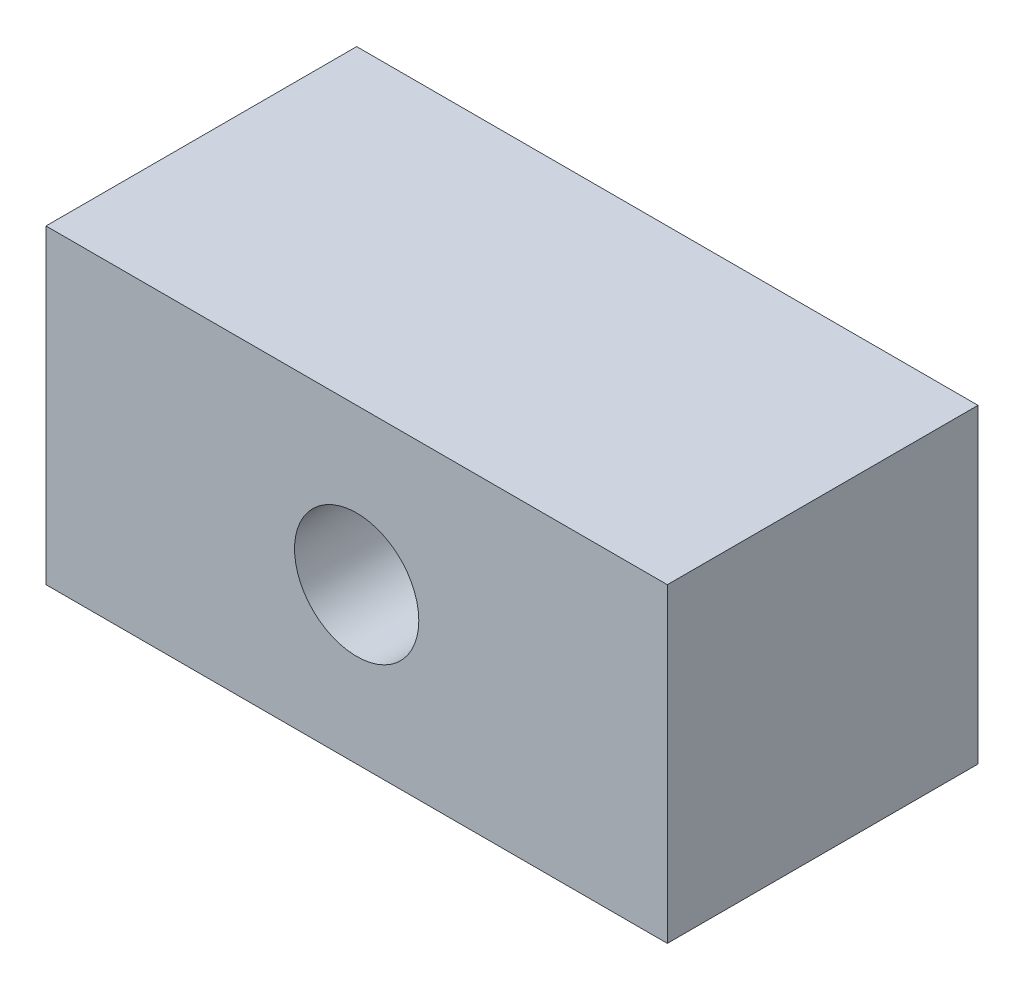
ISO-10303-21;
HEADER;
FILE_DESCRIPTION(('STEP AP214'),'2;1');
FILE_NAME('part.step','',(''),(''),'','','');
FILE_SCHEMA(('AUTOMOTIVE_DESIGN { 1 0 10303 214 1 1 1 1 }'));
ENDSEC;
DATA;
#1=APPLICATION_CONTEXT('core data for automotive mechanical design processes');
#2=APPLICATION_PROTOCOL_DEFINITION('international standard','automotive_design',2000,#1);
#3=PRODUCT_CONTEXT('',#1,'mechanical');
#4=PRODUCT('Part','Part','',(#3));
#5=PRODUCT_RELATED_PRODUCT_CATEGORY('part','',(#4));
#6=PRODUCT_DEFINITION_FORMATION('','',#4);
#7=PRODUCT_DEFINITION_CONTEXT('part definition',#1,'design');
#8=PRODUCT_DEFINITION('design','',#6,#7);
#9=PRODUCT_DEFINITION_SHAPE('','',#8);
#10=(LENGTH_UNIT() NAMED_UNIT(*) SI_UNIT(.MILLI.,.METRE.));
#11=(NAMED_UNIT(*) PLANE_ANGLE_UNIT() SI_UNIT($,.RADIAN.));
#12=(NAMED_UNIT(*) SI_UNIT($,.STERADIAN.) SOLID_ANGLE_UNIT());
#13=UNCERTAINTY_MEASURE_WITH_UNIT(LENGTH_MEASURE(1.E-05),#10,'distance_accuracy_value','');
#14=(GEOMETRIC_REPRESENTATION_CONTEXT(3) GLOBAL_UNCERTAINTY_ASSIGNED_CONTEXT((#13)) GLOBAL_UNIT_ASSIGNED_CONTEXT((#10,
#11,#12)) REPRESENTATION_CONTEXT('',''));
#15=CARTESIAN_POINT('',(0.,0.,0.));
#16=DIRECTION('',(0.,0.,1.));
#17=DIRECTION('',(1.,0.,0.));
#18=AXIS2_PLACEMENT_3D('',#15,#16,#17);
#19=CARTESIAN_POINT('',(-20.9615384615385,20.,-4.51923076923077));
#20=DIRECTION('',(1.,0.,0.));
#21=DIRECTION('',(0.,0.,-1.));
#22=AXIS2_PLACEMENT_3D('',#19,#20,#21);
#23=PLANE('',#22);
#24=DIRECTION('',(0.,0.,1.));
#25=VECTOR('',#24,1.);
#26=CARTESIAN_POINT('',(-20.9615384615385,0.,-4.51923076923077));
#27=LINE('',#26,#25);
#28=CARTESIAN_POINT('',(-20.9615384615385,0.,-4.51923076923077));
#29=VERTEX_POINT('',#28);
#30=CARTESIAN_POINT('',(-20.9615384615385,0.,15.4807692307692));
#31=VERTEX_POINT('',#30);
#32=EDGE_CURVE('E96',#29,#31,#27,.T.);
#33=ORIENTED_EDGE('',*,*,#32,.T.);
#34=DIRECTION('',(0.,-1.,0.));
#35=VECTOR('',#34,1.);
#36=CARTESIAN_POINT('',(-20.9615384615385,20.,15.4807692307692));
#37=LINE('',#36,#35);
#38=CARTESIAN_POINT('',(-20.9615384615385,20.,15.4807692307692));
#39=VERTEX_POINT('',#38);
#40=EDGE_CURVE('E11',#39,#31,#37,.T.);
#41=ORIENTED_EDGE('',*,*,#40,.F.);
#42=DIRECTION('',(0.,0.,1.));
#43=VECTOR('',#42,1.);
#44=CARTESIAN_POINT('',(-20.9615384615385,20.,-4.51923076923077));
#45=LINE('',#44,#43);
#46=CARTESIAN_POINT('',(-20.9615384615385,20.,-4.51923076923077));
#47=VERTEX_POINT('',#46);
#48=EDGE_CURVE('E84',#47,#39,#45,.T.);
#49=ORIENTED_EDGE('',*,*,#48,.F.);
#50=DIRECTION('',(0.,-1.,0.));
#51=VECTOR('',#50,1.);
#52=CARTESIAN_POINT('',(-20.9615384615385,20.,-4.51923076923077));
#53=LINE('',#52,#51);
#54=EDGE_CURVE('E92',#47,#29,#53,.T.);
#55=ORIENTED_EDGE('',*,*,#54,.T.);
#56=EDGE_LOOP('',(#33,#41,#49,#55));
#57=FACE_BOUND('',#56,.T.);
#58=ADVANCED_FACE('F33',(#57),#23,.F.);
#59=CARTESIAN_POINT('',(-20.9615384615385,20.,15.4807692307692));
#60=DIRECTION('',(0.,0.,-1.));
#61=DIRECTION('',(-1.,0.,0.));
#62=AXIS2_PLACEMENT_3D('',#59,#60,#61);
#63=PLANE('',#62);
#64=CARTESIAN_POINT('',(-0.961538461538465,10.,15.4807692307692));
#65=DIRECTION('',(0.,0.,1.));
#66=DIRECTION('',(1.,0.,0.));
#67=AXIS2_PLACEMENT_3D('',#64,#65,#66);
#68=CIRCLE('',#67,4.);
#69=CARTESIAN_POINT('',(3.03846153846154,10.,15.4807692307692));
#70=VERTEX_POINT('',#69);
#71=EDGE_CURVE('E110',#70,#70,#68,.T.);
#72=ORIENTED_EDGE('',*,*,#71,.F.);
#73=EDGE_LOOP('',(#72));
#74=FACE_BOUND('',#73,.T.);
#75=DIRECTION('',(1.,0.,0.));
#76=VECTOR('',#75,1.);
#77=CARTESIAN_POINT('',(-20.9615384615385,0.,15.4807692307692));
#78=LINE('',#77,#76);
#79=CARTESIAN_POINT('',(19.0384615384615,0.,15.4807692307692));
#80=VERTEX_POINT('',#79);
#81=EDGE_CURVE('E88',#31,#80,#78,.T.);
#82=ORIENTED_EDGE('',*,*,#81,.T.);
#83=DIRECTION('',(0.,-1.,0.));
#84=VECTOR('',#83,1.);
#85=CARTESIAN_POINT('',(19.0384615384615,20.,15.4807692307692));
#86=LINE('',#85,#84);
#87=CARTESIAN_POINT('',(19.0384615384615,20.,15.4807692307692));
#88=VERTEX_POINT('',#87);
#89=EDGE_CURVE('E41',#88,#80,#86,.T.);
#90=ORIENTED_EDGE('',*,*,#89,.F.);
#91=DIRECTION('',(1.,0.,0.));
#92=VECTOR('',#91,1.);
#93=CARTESIAN_POINT('',(-20.9615384615385,20.,15.4807692307692));
#94=LINE('',#93,#92);
#95=EDGE_CURVE('E79',#39,#88,#94,.T.);
#96=ORIENTED_EDGE('',*,*,#95,.F.);
#97=ORIENTED_EDGE('',*,*,#40,.T.);
#98=EDGE_LOOP('',(#82,#90,#96,#97));
#99=FACE_BOUND('',#98,.T.);
#100=ADVANCED_FACE('F87',(#74,#99),#63,.F.);
#101=CARTESIAN_POINT('',(19.0384615384615,20.,-4.51923076923077));
#102=DIRECTION('',(-1.,0.,0.));
#103=DIRECTION('',(0.,0.,1.));
#104=AXIS2_PLACEMENT_3D('',#101,#102,#103);
#105=PLANE('',#104);
#106=DIRECTION('',(0.,0.,-1.));
#107=VECTOR('',#106,1.);
#108=CARTESIAN_POINT('',(19.0384615384615,0.,-4.51923076923077));
#109=LINE('',#108,#107);
#110=CARTESIAN_POINT('',(19.0384615384615,0.,-4.51923076923077));
#111=VERTEX_POINT('',#110);
#112=EDGE_CURVE('E66',#80,#111,#109,.T.);
#113=ORIENTED_EDGE('',*,*,#112,.T.);
#114=DIRECTION('',(0.,-1.,0.));
#115=VECTOR('',#114,1.);
#116=CARTESIAN_POINT('',(19.0384615384615,20.,-4.51923076923077));
#117=LINE('',#116,#115);
#118=CARTESIAN_POINT('',(19.0384615384615,20.,-4.51923076923077));
#119=VERTEX_POINT('',#118);
#120=EDGE_CURVE('E89',#119,#111,#117,.T.);
#121=ORIENTED_EDGE('',*,*,#120,.F.);
#122=DIRECTION('',(0.,0.,-1.));
#123=VECTOR('',#122,1.);
#124=CARTESIAN_POINT('',(19.0384615384615,20.,-4.51923076923077));
#125=LINE('',#124,#123);
#126=EDGE_CURVE('E82',#88,#119,#125,.T.);
#127=ORIENTED_EDGE('',*,*,#126,.F.);
#128=ORIENTED_EDGE('',*,*,#89,.T.);
#129=EDGE_LOOP('',(#113,#121,#127,#128));
#130=FACE_BOUND('',#129,.T.);
#131=ADVANCED_FACE('F90',(#130),#105,.F.);
#132=CARTESIAN_POINT('',(-20.9615384615385,20.,-4.51923076923077));
#133=DIRECTION('',(0.,0.,1.));
#134=DIRECTION('',(1.,0.,0.));
#135=AXIS2_PLACEMENT_3D('',#132,#133,#134);
#136=PLANE('',#135);
#137=CARTESIAN_POINT('',(-0.961538461538465,10.,-4.51923076923078));
#138=DIRECTION('',(0.,0.,1.));
#139=DIRECTION('',(1.,0.,0.));
#140=AXIS2_PLACEMENT_3D('',#137,#138,#139);
#141=CIRCLE('',#140,4.);
#142=CARTESIAN_POINT('',(3.03846153846154,10.,-4.51923076923078));
#143=VERTEX_POINT('',#142);
#144=EDGE_CURVE('E99',#143,#143,#141,.T.);
#145=ORIENTED_EDGE('',*,*,#144,.T.);
#146=EDGE_LOOP('',(#145));
#147=FACE_BOUND('',#146,.T.);
#148=DIRECTION('',(-1.,0.,0.));
#149=VECTOR('',#148,1.);
#150=CARTESIAN_POINT('',(-20.9615384615385,0.,-4.51923076923077));
#151=LINE('',#150,#149);
#152=EDGE_CURVE('E72',#111,#29,#151,.T.);
#153=ORIENTED_EDGE('',*,*,#152,.T.);
#154=ORIENTED_EDGE('',*,*,#54,.F.);
#155=DIRECTION('',(-1.,0.,0.));
#156=VECTOR('',#155,1.);
#157=CARTESIAN_POINT('',(-20.9615384615385,20.,-4.51923076923077));
#158=LINE('',#157,#156);
#159=EDGE_CURVE('E49',#119,#47,#158,.T.);
#160=ORIENTED_EDGE('',*,*,#159,.F.);
#161=ORIENTED_EDGE('',*,*,#120,.T.);
#162=EDGE_LOOP('',(#153,#154,#160,#161));
#163=FACE_BOUND('',#162,.T.);
#164=ADVANCED_FACE('F104',(#147,#163),#136,.F.);
#165=CARTESIAN_POINT('',(0.,20.,0.));
#166=DIRECTION('',(0.,1.,0.));
#167=DIRECTION('',(0.,0.,1.));
#168=AXIS2_PLACEMENT_3D('',#165,#166,#167);
#169=PLANE('',#168);
#170=ORIENTED_EDGE('',*,*,#48,.T.);
#171=ORIENTED_EDGE('',*,*,#95,.T.);
#172=ORIENTED_EDGE('',*,*,#126,.T.);
#173=ORIENTED_EDGE('',*,*,#159,.T.);
#174=EDGE_LOOP('',(#170,#171,#172,#173));
#175=FACE_BOUND('',#174,.T.);
#176=ADVANCED_FACE('F80',(#175),#169,.T.);
#177=CARTESIAN_POINT('',(0.,0.,0.));
#178=DIRECTION('',(0.,1.,0.));
#179=DIRECTION('',(0.,0.,1.));
#180=AXIS2_PLACEMENT_3D('',#177,#178,#179);
#181=PLANE('',#180);
#182=ORIENTED_EDGE('',*,*,#32,.F.);
#183=ORIENTED_EDGE('',*,*,#152,.F.);
#184=ORIENTED_EDGE('',*,*,#112,.F.);
#185=ORIENTED_EDGE('',*,*,#81,.F.);
#186=EDGE_LOOP('',(#182,#183,#184,#185));
#187=FACE_BOUND('',#186,.T.);
#188=ADVANCED_FACE('F107',(#187),#181,.F.);
#189=CARTESIAN_POINT('',(-0.961538461538465,10.,-4.51923076923078));
#190=DIRECTION('',(0.,0.,1.));
#191=DIRECTION('',(1.,0.,0.));
#192=AXIS2_PLACEMENT_3D('',#189,#190,#191);
#193=CYLINDRICAL_SURFACE('',#192,4.);
#194=ORIENTED_EDGE('',*,*,#144,.F.);
#195=EDGE_LOOP('',(#194));
#196=FACE_BOUND('',#195,.T.);
#197=ORIENTED_EDGE('',*,*,#71,.T.);
#198=EDGE_LOOP('',(#197));
#199=FACE_BOUND('',#198,.T.);
#200=ADVANCED_FACE('F117',(#196,#199),#193,.F.);
#201=CLOSED_SHELL('',(#58,#100,#131,#164,#176,#188,#200));
#202=MANIFOLD_SOLID_BREP('B2',#201);
#203=ADVANCED_BREP_SHAPE_REPRESENTATION('',(#18,#202),#14);
#204=SHAPE_DEFINITION_REPRESENTATION(#9,#203);
ENDSEC;
END-ISO-10303-21;
